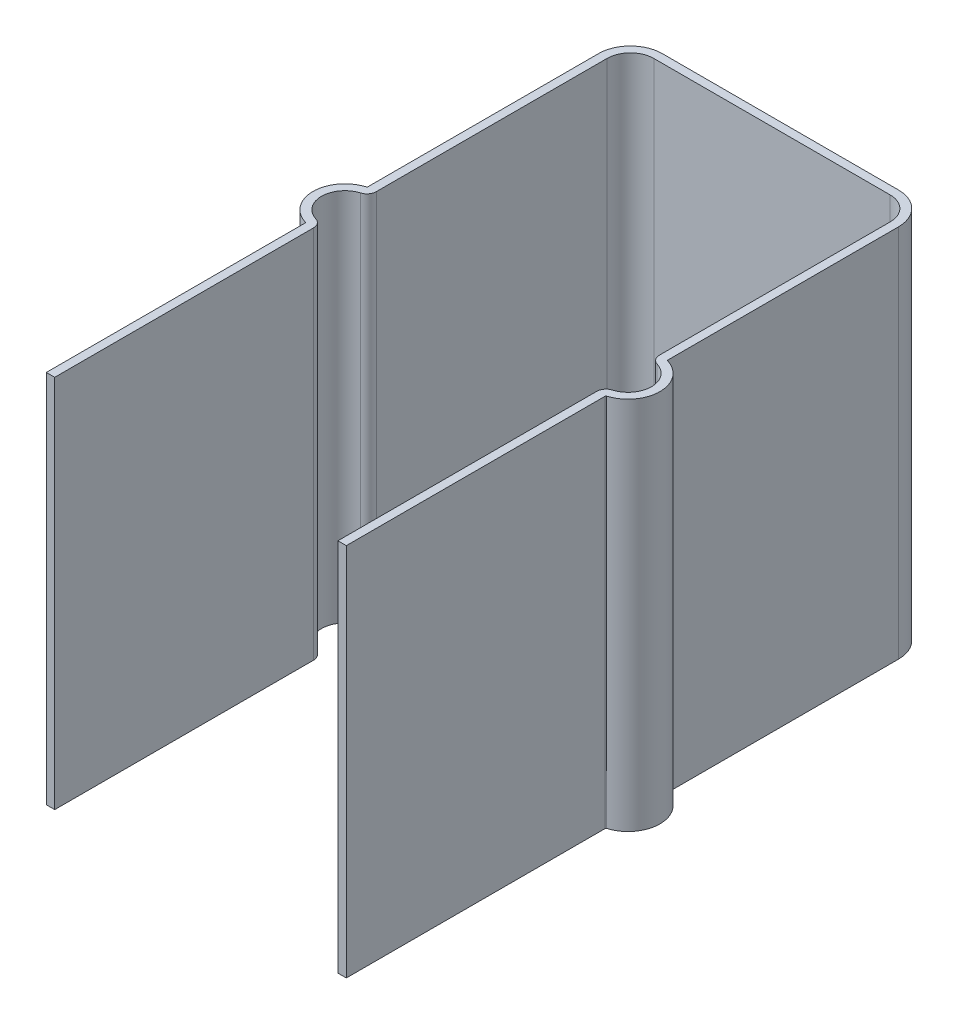
ISO-10303-21;
HEADER;
FILE_DESCRIPTION(('STEP AP214'),'2;1');
FILE_NAME('part.step','',(''),(''),'','','');
FILE_SCHEMA(('AUTOMOTIVE_DESIGN { 1 0 10303 214 1 1 1 1 }'));
ENDSEC;
DATA;
#1=APPLICATION_CONTEXT('core data for automotive mechanical design processes');
#2=APPLICATION_PROTOCOL_DEFINITION('international standard','automotive_design',2000,#1);
#3=PRODUCT_CONTEXT('',#1,'mechanical');
#4=PRODUCT('Part','Part','',(#3));
#5=PRODUCT_RELATED_PRODUCT_CATEGORY('part','',(#4));
#6=PRODUCT_DEFINITION_FORMATION('','',#4);
#7=PRODUCT_DEFINITION_CONTEXT('part definition',#1,'design');
#8=PRODUCT_DEFINITION('design','',#6,#7);
#9=PRODUCT_DEFINITION_SHAPE('','',#8);
#10=(LENGTH_UNIT() NAMED_UNIT(*) SI_UNIT(.MILLI.,.METRE.));
#11=(NAMED_UNIT(*) PLANE_ANGLE_UNIT() SI_UNIT($,.RADIAN.));
#12=(NAMED_UNIT(*) SI_UNIT($,.STERADIAN.) SOLID_ANGLE_UNIT());
#13=UNCERTAINTY_MEASURE_WITH_UNIT(LENGTH_MEASURE(1.E-05),#10,'distance_accuracy_value','');
#14=(GEOMETRIC_REPRESENTATION_CONTEXT(3) GLOBAL_UNCERTAINTY_ASSIGNED_CONTEXT((#13)) GLOBAL_UNIT_ASSIGNED_CONTEXT((#10,
#11,#12)) REPRESENTATION_CONTEXT('',''));
#15=CARTESIAN_POINT('',(0.,0.,0.));
#16=DIRECTION('',(0.,0.,1.));
#17=DIRECTION('',(1.,0.,0.));
#18=AXIS2_PLACEMENT_3D('',#15,#16,#17);
#19=CARTESIAN_POINT('',(3.025,8.,0.670820393249937));
#20=DIRECTION('',(1.,0.,0.));
#21=DIRECTION('',(0.,0.,-1.));
#22=AXIS2_PLACEMENT_3D('',#19,#20,#21);
#23=PLANE('',#22);
#24=DIRECTION('',(0.,0.,1.));
#25=VECTOR('',#24,1.);
#26=CARTESIAN_POINT('',(3.025,0.,0.670820393249937));
#27=LINE('',#26,#25);
#28=CARTESIAN_POINT('',(3.025,0.,0.670820393249937));
#29=VERTEX_POINT('',#28);
#30=CARTESIAN_POINT('',(3.025,0.,6.2));
#31=VERTEX_POINT('',#30);
#32=EDGE_CURVE('E247',#29,#31,#27,.T.);
#33=ORIENTED_EDGE('',*,*,#32,.T.);
#34=DIRECTION('',(0.,-1.,0.));
#35=VECTOR('',#34,1.);
#36=CARTESIAN_POINT('',(3.025,8.,6.2));
#37=LINE('',#36,#35);
#38=CARTESIAN_POINT('',(3.025,8.,6.2));
#39=VERTEX_POINT('',#38);
#40=EDGE_CURVE('E11',#39,#31,#37,.T.);
#41=ORIENTED_EDGE('',*,*,#40,.F.);
#42=DIRECTION('',(0.,0.,1.));
#43=VECTOR('',#42,1.);
#44=CARTESIAN_POINT('',(3.025,8.,0.670820393249937));
#45=LINE('',#44,#43);
#46=CARTESIAN_POINT('',(3.025,8.,0.670820393249937));
#47=VERTEX_POINT('',#46);
#48=EDGE_CURVE('E148',#47,#39,#45,.T.);
#49=ORIENTED_EDGE('',*,*,#48,.F.);
#50=DIRECTION('',(0.,-1.,0.));
#51=VECTOR('',#50,1.);
#52=CARTESIAN_POINT('',(3.025,8.,0.670820393249937));
#53=LINE('',#52,#51);
#54=EDGE_CURVE('E243',#47,#29,#53,.T.);
#55=ORIENTED_EDGE('',*,*,#54,.T.);
#56=EDGE_LOOP('',(#33,#41,#49,#55));
#57=FACE_BOUND('',#56,.T.);
#58=ADVANCED_FACE('F32',(#57),#23,.F.);
#59=CARTESIAN_POINT('',(3.205,8.,6.2));
#60=DIRECTION('',(0.,0.,1.));
#61=DIRECTION('',(1.,0.,0.));
#62=AXIS2_PLACEMENT_3D('',#59,#60,#61);
#63=PLANE('',#62);
#64=DIRECTION('',(-1.,0.,0.));
#65=VECTOR('',#64,1.);
#66=CARTESIAN_POINT('',(3.205,0.,6.2));
#67=LINE('',#66,#65);
#68=CARTESIAN_POINT('',(3.205,0.,6.2));
#69=VERTEX_POINT('',#68);
#70=EDGE_CURVE('E250',#69,#31,#67,.T.);
#71=ORIENTED_EDGE('',*,*,#70,.F.);
#72=DIRECTION('',(0.,-1.,0.));
#73=VECTOR('',#72,1.);
#74=CARTESIAN_POINT('',(3.205,8.,6.2));
#75=LINE('',#74,#73);
#76=CARTESIAN_POINT('',(3.205,8.,6.2));
#77=VERTEX_POINT('',#76);
#78=EDGE_CURVE('E40',#77,#69,#75,.T.);
#79=ORIENTED_EDGE('',*,*,#78,.F.);
#80=DIRECTION('',(-1.,0.,0.));
#81=VECTOR('',#80,1.);
#82=CARTESIAN_POINT('',(3.205,8.,6.2));
#83=LINE('',#82,#81);
#84=EDGE_CURVE('E392',#77,#39,#83,.T.);
#85=ORIENTED_EDGE('',*,*,#84,.T.);
#86=ORIENTED_EDGE('',*,*,#40,.T.);
#87=EDGE_LOOP('',(#71,#79,#85,#86));
#88=FACE_BOUND('',#87,.T.);
#89=ADVANCED_FACE('F379',(#88),#63,.T.);
#90=CARTESIAN_POINT('',(3.205,8.,0.670820393249937));
#91=DIRECTION('',(1.,0.,0.));
#92=DIRECTION('',(0.,0.,-1.));
#93=AXIS2_PLACEMENT_3D('',#90,#91,#92);
#94=PLANE('',#93);
#95=DIRECTION('',(0.,0.,1.));
#96=VECTOR('',#95,1.);
#97=CARTESIAN_POINT('',(3.205,0.,0.670820393249937));
#98=LINE('',#97,#96);
#99=CARTESIAN_POINT('',(3.205,0.,0.670820393249937));
#100=VERTEX_POINT('',#99);
#101=EDGE_CURVE('E253',#100,#69,#98,.T.);
#102=ORIENTED_EDGE('',*,*,#101,.F.);
#103=DIRECTION('',(0.,-1.,0.));
#104=VECTOR('',#103,1.);
#105=CARTESIAN_POINT('',(3.205,8.,0.670820393249937));
#106=LINE('',#105,#104);
#107=CARTESIAN_POINT('',(3.205,8.,0.670820393249937));
#108=VERTEX_POINT('',#107);
#109=EDGE_CURVE('E369',#108,#100,#106,.T.);
#110=ORIENTED_EDGE('',*,*,#109,.F.);
#111=DIRECTION('',(0.,0.,1.));
#112=VECTOR('',#111,1.);
#113=CARTESIAN_POINT('',(3.205,8.,0.670820393249937));
#114=LINE('',#113,#112);
#115=EDGE_CURVE('E376',#108,#77,#114,.T.);
#116=ORIENTED_EDGE('',*,*,#115,.T.);
#117=ORIENTED_EDGE('',*,*,#78,.T.);
#118=EDGE_LOOP('',(#102,#110,#116,#117));
#119=FACE_BOUND('',#118,.T.);
#120=ADVANCED_FACE('F374',(#119),#94,.T.);
#121=CARTESIAN_POINT('',(3.225,8.,0.670820393249937));
#122=DIRECTION('',(0.,-1.,0.));
#123=DIRECTION('',(0.,0.,-1.));
#124=AXIS2_PLACEMENT_3D('',#121,#122,#123);
#125=CYLINDRICAL_SURFACE('',#124,0.0199999999999998);
#126=CARTESIAN_POINT('',(3.225,0.,0.670820393249937));
#127=DIRECTION('',(0.,1.,0.));
#128=DIRECTION('',(1.,0.,0.));
#129=AXIS2_PLACEMENT_3D('',#126,#127,#128);
#130=CIRCLE('',#129,0.0199999999999998);
#131=CARTESIAN_POINT('',(3.21928571428571,0.,0.651654096299939));
#132=VERTEX_POINT('',#131);
#133=EDGE_CURVE('E256',#132,#100,#130,.T.);
#134=ORIENTED_EDGE('',*,*,#133,.F.);
#135=DIRECTION('',(0.,-1.,0.));
#136=VECTOR('',#135,1.);
#137=CARTESIAN_POINT('',(3.21928571428571,8.,0.651654096299939));
#138=LINE('',#137,#136);
#139=CARTESIAN_POINT('',(3.21928571428571,8.,0.651654096299939));
#140=VERTEX_POINT('',#139);
#141=EDGE_CURVE('E367',#140,#132,#138,.T.);
#142=ORIENTED_EDGE('',*,*,#141,.F.);
#143=CARTESIAN_POINT('',(3.225,8.,0.670820393249937));
#144=DIRECTION('',(0.,1.,0.));
#145=DIRECTION('',(1.,0.,0.));
#146=AXIS2_PLACEMENT_3D('',#143,#144,#145);
#147=CIRCLE('',#146,0.0199999999999998);
#148=EDGE_CURVE('E389',#140,#108,#147,.T.);
#149=ORIENTED_EDGE('',*,*,#148,.T.);
#150=ORIENTED_EDGE('',*,*,#109,.T.);
#151=EDGE_LOOP('',(#134,#142,#149,#150));
#152=FACE_BOUND('',#151,.T.);
#153=ADVANCED_FACE('F386',(#152),#125,.F.);
#154=CARTESIAN_POINT('',(3.025,8.,0.));
#155=DIRECTION('',(0.,-1.,0.));
#156=DIRECTION('',(0.,0.,-1.));
#157=AXIS2_PLACEMENT_3D('',#154,#155,#156);
#158=CYLINDRICAL_SURFACE('',#157,0.68);
#159=CARTESIAN_POINT('',(3.025,0.,0.));
#160=DIRECTION('',(0.,1.,0.));
#161=DIRECTION('',(1.,0.,0.));
#162=AXIS2_PLACEMENT_3D('',#159,#160,#161);
#163=CIRCLE('',#162,0.68);
#164=CARTESIAN_POINT('',(3.21928571428571,0.,-0.651654096299938));
#165=VERTEX_POINT('',#164);
#166=EDGE_CURVE('E259',#165,#132,#163,.F.);
#167=ORIENTED_EDGE('',*,*,#166,.F.);
#168=DIRECTION('',(0.,-1.,0.));
#169=VECTOR('',#168,1.);
#170=CARTESIAN_POINT('',(3.21928571428571,8.,-0.651654096299938));
#171=LINE('',#170,#169);
#172=CARTESIAN_POINT('',(3.21928571428571,8.,-0.651654096299938));
#173=VERTEX_POINT('',#172);
#174=EDGE_CURVE('E365',#173,#165,#171,.T.);
#175=ORIENTED_EDGE('',*,*,#174,.F.);
#176=CARTESIAN_POINT('',(3.025,8.,0.));
#177=DIRECTION('',(0.,1.,0.));
#178=DIRECTION('',(1.,0.,0.));
#179=AXIS2_PLACEMENT_3D('',#176,#177,#178);
#180=CIRCLE('',#179,0.68);
#181=EDGE_CURVE('E394',#173,#140,#180,.F.);
#182=ORIENTED_EDGE('',*,*,#181,.T.);
#183=ORIENTED_EDGE('',*,*,#141,.T.);
#184=EDGE_LOOP('',(#167,#175,#182,#183));
#185=FACE_BOUND('',#184,.T.);
#186=ADVANCED_FACE('F480',(#185),#158,.T.);
#187=CARTESIAN_POINT('',(3.225,8.,-0.670820393249937));
#188=DIRECTION('',(0.,-1.,0.));
#189=DIRECTION('',(0.,0.,-1.));
#190=AXIS2_PLACEMENT_3D('',#187,#188,#189);
#191=CYLINDRICAL_SURFACE('',#190,0.0200000000000002);
#192=CARTESIAN_POINT('',(3.225,0.,-0.670820393249937));
#193=DIRECTION('',(0.,1.,0.));
#194=DIRECTION('',(1.,0.,0.));
#195=AXIS2_PLACEMENT_3D('',#192,#193,#194);
#196=CIRCLE('',#195,0.0200000000000002);
#197=CARTESIAN_POINT('',(3.205,0.,-0.670820393249937));
#198=VERTEX_POINT('',#197);
#199=EDGE_CURVE('E262',#198,#165,#196,.T.);
#200=ORIENTED_EDGE('',*,*,#199,.F.);
#201=DIRECTION('',(0.,-1.,0.));
#202=VECTOR('',#201,1.);
#203=CARTESIAN_POINT('',(3.205,8.,-0.670820393249937));
#204=LINE('',#203,#202);
#205=CARTESIAN_POINT('',(3.205,8.,-0.670820393249937));
#206=VERTEX_POINT('',#205);
#207=EDGE_CURVE('E363',#206,#198,#204,.T.);
#208=ORIENTED_EDGE('',*,*,#207,.F.);
#209=CARTESIAN_POINT('',(3.225,8.,-0.670820393249937));
#210=DIRECTION('',(0.,1.,0.));
#211=DIRECTION('',(1.,0.,0.));
#212=AXIS2_PLACEMENT_3D('',#209,#210,#211);
#213=CIRCLE('',#212,0.0200000000000002);
#214=EDGE_CURVE('E400',#206,#173,#213,.T.);
#215=ORIENTED_EDGE('',*,*,#214,.T.);
#216=ORIENTED_EDGE('',*,*,#174,.T.);
#217=EDGE_LOOP('',(#200,#208,#215,#216));
#218=FACE_BOUND('',#217,.T.);
#219=ADVANCED_FACE('F483',(#218),#191,.F.);
#220=CARTESIAN_POINT('',(3.205,8.,-5.6));
#221=DIRECTION('',(1.,0.,0.));
#222=DIRECTION('',(0.,0.,-1.));
#223=AXIS2_PLACEMENT_3D('',#220,#221,#222);
#224=PLANE('',#223);
#225=DIRECTION('',(0.,0.,-1.));
#226=VECTOR('',#225,1.);
#227=CARTESIAN_POINT('',(3.205,0.,-5.6));
#228=LINE('',#227,#226);
#229=CARTESIAN_POINT('',(3.205,0.,-5.6));
#230=VERTEX_POINT('',#229);
#231=EDGE_CURVE('E265',#230,#198,#228,.F.);
#232=ORIENTED_EDGE('',*,*,#231,.F.);
#233=DIRECTION('',(0.,-1.,0.));
#234=VECTOR('',#233,1.);
#235=CARTESIAN_POINT('',(3.205,8.,-5.6));
#236=LINE('',#235,#234);
#237=CARTESIAN_POINT('',(3.205,8.,-5.6));
#238=VERTEX_POINT('',#237);
#239=EDGE_CURVE('E361',#238,#230,#236,.T.);
#240=ORIENTED_EDGE('',*,*,#239,.F.);
#241=DIRECTION('',(0.,0.,-1.));
#242=VECTOR('',#241,1.);
#243=CARTESIAN_POINT('',(3.205,8.,-5.6));
#244=LINE('',#243,#242);
#245=EDGE_CURVE('E403',#238,#206,#244,.F.);
#246=ORIENTED_EDGE('',*,*,#245,.T.);
#247=ORIENTED_EDGE('',*,*,#207,.T.);
#248=EDGE_LOOP('',(#232,#240,#246,#247));
#249=FACE_BOUND('',#248,.T.);
#250=ADVANCED_FACE('F487',(#249),#224,.T.);
#251=CARTESIAN_POINT('',(2.525,8.,-5.6));
#252=DIRECTION('',(0.,-1.,0.));
#253=DIRECTION('',(0.,0.,-1.));
#254=AXIS2_PLACEMENT_3D('',#251,#252,#253);
#255=CYLINDRICAL_SURFACE('',#254,0.68);
#256=CARTESIAN_POINT('',(2.525,0.,-5.6));
#257=DIRECTION('',(0.,1.,0.));
#258=DIRECTION('',(1.,0.,0.));
#259=AXIS2_PLACEMENT_3D('',#256,#257,#258);
#260=CIRCLE('',#259,0.68);
#261=CARTESIAN_POINT('',(2.525,0.,-6.28));
#262=VERTEX_POINT('',#261);
#263=EDGE_CURVE('E268',#262,#230,#260,.F.);
#264=ORIENTED_EDGE('',*,*,#263,.F.);
#265=DIRECTION('',(0.,-1.,0.));
#266=VECTOR('',#265,1.);
#267=CARTESIAN_POINT('',(2.525,8.,-6.28));
#268=LINE('',#267,#266);
#269=CARTESIAN_POINT('',(2.525,8.,-6.28));
#270=VERTEX_POINT('',#269);
#271=EDGE_CURVE('E359',#270,#262,#268,.T.);
#272=ORIENTED_EDGE('',*,*,#271,.F.);
#273=CARTESIAN_POINT('',(2.525,8.,-5.6));
#274=DIRECTION('',(0.,1.,0.));
#275=DIRECTION('',(1.,0.,0.));
#276=AXIS2_PLACEMENT_3D('',#273,#274,#275);
#277=CIRCLE('',#276,0.68);
#278=EDGE_CURVE('E406',#270,#238,#277,.F.);
#279=ORIENTED_EDGE('',*,*,#278,.T.);
#280=ORIENTED_EDGE('',*,*,#239,.T.);
#281=EDGE_LOOP('',(#264,#272,#279,#280));
#282=FACE_BOUND('',#281,.T.);
#283=ADVANCED_FACE('F491',(#282),#255,.T.);
#284=CARTESIAN_POINT('',(-2.525,8.,-6.28));
#285=DIRECTION('',(0.,0.,-1.));
#286=DIRECTION('',(-1.,0.,0.));
#287=AXIS2_PLACEMENT_3D('',#284,#285,#286);
#288=PLANE('',#287);
#289=DIRECTION('',(1.,0.,0.));
#290=VECTOR('',#289,1.);
#291=CARTESIAN_POINT('',(-2.525,0.,-6.28));
#292=LINE('',#291,#290);
#293=CARTESIAN_POINT('',(-2.525,0.,-6.28));
#294=VERTEX_POINT('',#293);
#295=EDGE_CURVE('E271',#294,#262,#292,.T.);
#296=ORIENTED_EDGE('',*,*,#295,.F.);
#297=DIRECTION('',(0.,-1.,0.));
#298=VECTOR('',#297,1.);
#299=CARTESIAN_POINT('',(-2.525,8.,-6.28));
#300=LINE('',#299,#298);
#301=CARTESIAN_POINT('',(-2.525,8.,-6.28));
#302=VERTEX_POINT('',#301);
#303=EDGE_CURVE('E357',#302,#294,#300,.T.);
#304=ORIENTED_EDGE('',*,*,#303,.F.);
#305=DIRECTION('',(1.,0.,0.));
#306=VECTOR('',#305,1.);
#307=CARTESIAN_POINT('',(-2.525,8.,-6.28));
#308=LINE('',#307,#306);
#309=EDGE_CURVE('E409',#302,#270,#308,.T.);
#310=ORIENTED_EDGE('',*,*,#309,.T.);
#311=ORIENTED_EDGE('',*,*,#271,.T.);
#312=EDGE_LOOP('',(#296,#304,#310,#311));
#313=FACE_BOUND('',#312,.T.);
#314=ADVANCED_FACE('F495',(#313),#288,.T.);
#315=CARTESIAN_POINT('',(-2.525,8.,-5.6));
#316=DIRECTION('',(0.,-1.,0.));
#317=DIRECTION('',(0.,0.,-1.));
#318=AXIS2_PLACEMENT_3D('',#315,#316,#317);
#319=CYLINDRICAL_SURFACE('',#318,0.68);
#320=CARTESIAN_POINT('',(-2.525,0.,-5.6));
#321=DIRECTION('',(0.,1.,0.));
#322=DIRECTION('',(1.,0.,0.));
#323=AXIS2_PLACEMENT_3D('',#320,#321,#322);
#324=CIRCLE('',#323,0.68);
#325=CARTESIAN_POINT('',(-3.205,0.,-5.6));
#326=VERTEX_POINT('',#325);
#327=EDGE_CURVE('E274',#326,#294,#324,.F.);
#328=ORIENTED_EDGE('',*,*,#327,.F.);
#329=DIRECTION('',(0.,-1.,0.));
#330=VECTOR('',#329,1.);
#331=CARTESIAN_POINT('',(-3.205,8.,-5.6));
#332=LINE('',#331,#330);
#333=CARTESIAN_POINT('',(-3.205,8.,-5.6));
#334=VERTEX_POINT('',#333);
#335=EDGE_CURVE('E355',#334,#326,#332,.T.);
#336=ORIENTED_EDGE('',*,*,#335,.F.);
#337=CARTESIAN_POINT('',(-2.525,8.,-5.6));
#338=DIRECTION('',(0.,1.,0.));
#339=DIRECTION('',(1.,0.,0.));
#340=AXIS2_PLACEMENT_3D('',#337,#338,#339);
#341=CIRCLE('',#340,0.68);
#342=EDGE_CURVE('E412',#334,#302,#341,.F.);
#343=ORIENTED_EDGE('',*,*,#342,.T.);
#344=ORIENTED_EDGE('',*,*,#303,.T.);
#345=EDGE_LOOP('',(#328,#336,#343,#344));
#346=FACE_BOUND('',#345,.T.);
#347=ADVANCED_FACE('F499',(#346),#319,.T.);
#348=CARTESIAN_POINT('',(-3.205,8.,-0.670820393249937));
#349=DIRECTION('',(-1.,0.,0.));
#350=DIRECTION('',(0.,0.,1.));
#351=AXIS2_PLACEMENT_3D('',#348,#349,#350);
#352=PLANE('',#351);
#353=DIRECTION('',(0.,0.,-1.));
#354=VECTOR('',#353,1.);
#355=CARTESIAN_POINT('',(-3.205,0.,-0.670820393249937));
#356=LINE('',#355,#354);
#357=CARTESIAN_POINT('',(-3.205,0.,-0.670820393249937));
#358=VERTEX_POINT('',#357);
#359=EDGE_CURVE('E277',#358,#326,#356,.T.);
#360=ORIENTED_EDGE('',*,*,#359,.F.);
#361=DIRECTION('',(0.,-1.,0.));
#362=VECTOR('',#361,1.);
#363=CARTESIAN_POINT('',(-3.205,8.,-0.670820393249937));
#364=LINE('',#363,#362);
#365=CARTESIAN_POINT('',(-3.205,8.,-0.670820393249937));
#366=VERTEX_POINT('',#365);
#367=EDGE_CURVE('E353',#366,#358,#364,.T.);
#368=ORIENTED_EDGE('',*,*,#367,.F.);
#369=DIRECTION('',(0.,0.,-1.));
#370=VECTOR('',#369,1.);
#371=CARTESIAN_POINT('',(-3.205,8.,-0.670820393249937));
#372=LINE('',#371,#370);
#373=EDGE_CURVE('E415',#366,#334,#372,.T.);
#374=ORIENTED_EDGE('',*,*,#373,.T.);
#375=ORIENTED_EDGE('',*,*,#335,.T.);
#376=EDGE_LOOP('',(#360,#368,#374,#375));
#377=FACE_BOUND('',#376,.T.);
#378=ADVANCED_FACE('F503',(#377),#352,.T.);
#379=CARTESIAN_POINT('',(-3.225,8.,-0.670820393249937));
#380=DIRECTION('',(0.,-1.,0.));
#381=DIRECTION('',(0.,0.,-1.));
#382=AXIS2_PLACEMENT_3D('',#379,#380,#381);
#383=CYLINDRICAL_SURFACE('',#382,0.0199999999999998);
#384=CARTESIAN_POINT('',(-3.225,0.,-0.670820393249937));
#385=DIRECTION('',(0.,1.,0.));
#386=DIRECTION('',(1.,0.,0.));
#387=AXIS2_PLACEMENT_3D('',#384,#385,#386);
#388=CIRCLE('',#387,0.0199999999999998);
#389=CARTESIAN_POINT('',(-3.21928571428571,0.,-0.651654096299939));
#390=VERTEX_POINT('',#389);
#391=EDGE_CURVE('E280',#390,#358,#388,.T.);
#392=ORIENTED_EDGE('',*,*,#391,.F.);
#393=DIRECTION('',(0.,-1.,0.));
#394=VECTOR('',#393,1.);
#395=CARTESIAN_POINT('',(-3.21928571428571,8.,-0.651654096299939));
#396=LINE('',#395,#394);
#397=CARTESIAN_POINT('',(-3.21928571428571,8.,-0.651654096299939));
#398=VERTEX_POINT('',#397);
#399=EDGE_CURVE('E351',#398,#390,#396,.T.);
#400=ORIENTED_EDGE('',*,*,#399,.F.);
#401=CARTESIAN_POINT('',(-3.225,8.,-0.670820393249937));
#402=DIRECTION('',(0.,1.,0.));
#403=DIRECTION('',(1.,0.,0.));
#404=AXIS2_PLACEMENT_3D('',#401,#402,#403);
#405=CIRCLE('',#404,0.0199999999999998);
#406=EDGE_CURVE('E418',#398,#366,#405,.T.);
#407=ORIENTED_EDGE('',*,*,#406,.T.);
#408=ORIENTED_EDGE('',*,*,#367,.T.);
#409=EDGE_LOOP('',(#392,#400,#407,#408));
#410=FACE_BOUND('',#409,.T.);
#411=ADVANCED_FACE('F507',(#410),#383,.F.);
#412=CARTESIAN_POINT('',(-3.025,8.,0.));
#413=DIRECTION('',(0.,-1.,0.));
#414=DIRECTION('',(0.,0.,-1.));
#415=AXIS2_PLACEMENT_3D('',#412,#413,#414);
#416=CYLINDRICAL_SURFACE('',#415,0.68);
#417=CARTESIAN_POINT('',(-3.025,0.,0.));
#418=DIRECTION('',(0.,1.,0.));
#419=DIRECTION('',(1.,0.,0.));
#420=AXIS2_PLACEMENT_3D('',#417,#418,#419);
#421=CIRCLE('',#420,0.68);
#422=CARTESIAN_POINT('',(-3.21928571428571,0.,0.651654096299939));
#423=VERTEX_POINT('',#422);
#424=EDGE_CURVE('E283',#423,#390,#421,.F.);
#425=ORIENTED_EDGE('',*,*,#424,.F.);
#426=DIRECTION('',(0.,-1.,0.));
#427=VECTOR('',#426,1.);
#428=CARTESIAN_POINT('',(-3.21928571428571,8.,0.651654096299939));
#429=LINE('',#428,#427);
#430=CARTESIAN_POINT('',(-3.21928571428571,8.,0.651654096299939));
#431=VERTEX_POINT('',#430);
#432=EDGE_CURVE('E349',#431,#423,#429,.T.);
#433=ORIENTED_EDGE('',*,*,#432,.F.);
#434=CARTESIAN_POINT('',(-3.025,8.,0.));
#435=DIRECTION('',(0.,1.,0.));
#436=DIRECTION('',(1.,0.,0.));
#437=AXIS2_PLACEMENT_3D('',#434,#435,#436);
#438=CIRCLE('',#437,0.68);
#439=EDGE_CURVE('E421',#431,#398,#438,.F.);
#440=ORIENTED_EDGE('',*,*,#439,.T.);
#441=ORIENTED_EDGE('',*,*,#399,.T.);
#442=EDGE_LOOP('',(#425,#433,#440,#441));
#443=FACE_BOUND('',#442,.T.);
#444=ADVANCED_FACE('F511',(#443),#416,.T.);
#445=CARTESIAN_POINT('',(-3.225,8.,0.670820393249937));
#446=DIRECTION('',(0.,-1.,0.));
#447=DIRECTION('',(0.,0.,-1.));
#448=AXIS2_PLACEMENT_3D('',#445,#446,#447);
#449=CYLINDRICAL_SURFACE('',#448,0.0199999999999998);
#450=CARTESIAN_POINT('',(-3.225,0.,0.670820393249937));
#451=DIRECTION('',(0.,1.,0.));
#452=DIRECTION('',(1.,0.,0.));
#453=AXIS2_PLACEMENT_3D('',#450,#451,#452);
#454=CIRCLE('',#453,0.0199999999999998);
#455=CARTESIAN_POINT('',(-3.205,0.,0.670820393249937));
#456=VERTEX_POINT('',#455);
#457=EDGE_CURVE('E286',#456,#423,#454,.T.);
#458=ORIENTED_EDGE('',*,*,#457,.F.);
#459=DIRECTION('',(0.,-1.,0.));
#460=VECTOR('',#459,1.);
#461=CARTESIAN_POINT('',(-3.205,8.,0.670820393249937));
#462=LINE('',#461,#460);
#463=CARTESIAN_POINT('',(-3.205,8.,0.670820393249937));
#464=VERTEX_POINT('',#463);
#465=EDGE_CURVE('E347',#464,#456,#462,.T.);
#466=ORIENTED_EDGE('',*,*,#465,.F.);
#467=CARTESIAN_POINT('',(-3.225,8.,0.670820393249937));
#468=DIRECTION('',(0.,1.,0.));
#469=DIRECTION('',(1.,0.,0.));
#470=AXIS2_PLACEMENT_3D('',#467,#468,#469);
#471=CIRCLE('',#470,0.0199999999999998);
#472=EDGE_CURVE('E424',#464,#431,#471,.T.);
#473=ORIENTED_EDGE('',*,*,#472,.T.);
#474=ORIENTED_EDGE('',*,*,#432,.T.);
#475=EDGE_LOOP('',(#458,#466,#473,#474));
#476=FACE_BOUND('',#475,.T.);
#477=ADVANCED_FACE('F515',(#476),#449,.F.);
#478=CARTESIAN_POINT('',(-3.205,8.,0.670820393249937));
#479=DIRECTION('',(-1.,0.,0.));
#480=DIRECTION('',(0.,0.,1.));
#481=AXIS2_PLACEMENT_3D('',#478,#479,#480);
#482=PLANE('',#481);
#483=DIRECTION('',(0.,0.,-1.));
#484=VECTOR('',#483,1.);
#485=CARTESIAN_POINT('',(-3.205,0.,0.670820393249937));
#486=LINE('',#485,#484);
#487=CARTESIAN_POINT('',(-3.205,0.,6.2));
#488=VERTEX_POINT('',#487);
#489=EDGE_CURVE('E289',#488,#456,#486,.T.);
#490=ORIENTED_EDGE('',*,*,#489,.F.);
#491=DIRECTION('',(0.,-1.,0.));
#492=VECTOR('',#491,1.);
#493=CARTESIAN_POINT('',(-3.205,8.,6.2));
#494=LINE('',#493,#492);
#495=CARTESIAN_POINT('',(-3.205,8.,6.2));
#496=VERTEX_POINT('',#495);
#497=EDGE_CURVE('E345',#496,#488,#494,.T.);
#498=ORIENTED_EDGE('',*,*,#497,.F.);
#499=DIRECTION('',(0.,0.,-1.));
#500=VECTOR('',#499,1.);
#501=CARTESIAN_POINT('',(-3.205,8.,0.670820393249937));
#502=LINE('',#501,#500);
#503=EDGE_CURVE('E427',#496,#464,#502,.T.);
#504=ORIENTED_EDGE('',*,*,#503,.T.);
#505=ORIENTED_EDGE('',*,*,#465,.T.);
#506=EDGE_LOOP('',(#490,#498,#504,#505));
#507=FACE_BOUND('',#506,.T.);
#508=ADVANCED_FACE('F519',(#507),#482,.T.);
#509=CARTESIAN_POINT('',(-3.025,8.,6.2));
#510=DIRECTION('',(0.,0.,1.));
#511=DIRECTION('',(1.,0.,0.));
#512=AXIS2_PLACEMENT_3D('',#509,#510,#511);
#513=PLANE('',#512);
#514=DIRECTION('',(-1.,0.,0.));
#515=VECTOR('',#514,1.);
#516=CARTESIAN_POINT('',(-3.025,0.,6.2));
#517=LINE('',#516,#515);
#518=CARTESIAN_POINT('',(-3.025,0.,6.2));
#519=VERTEX_POINT('',#518);
#520=EDGE_CURVE('E292',#519,#488,#517,.T.);
#521=ORIENTED_EDGE('',*,*,#520,.F.);
#522=DIRECTION('',(0.,-1.,0.));
#523=VECTOR('',#522,1.);
#524=CARTESIAN_POINT('',(-3.025,8.,6.2));
#525=LINE('',#524,#523);
#526=CARTESIAN_POINT('',(-3.025,8.,6.2));
#527=VERTEX_POINT('',#526);
#528=EDGE_CURVE('E343',#527,#519,#525,.T.);
#529=ORIENTED_EDGE('',*,*,#528,.F.);
#530=DIRECTION('',(-1.,0.,0.));
#531=VECTOR('',#530,1.);
#532=CARTESIAN_POINT('',(-3.025,8.,6.2));
#533=LINE('',#532,#531);
#534=EDGE_CURVE('E430',#527,#496,#533,.T.);
#535=ORIENTED_EDGE('',*,*,#534,.T.);
#536=ORIENTED_EDGE('',*,*,#497,.T.);
#537=EDGE_LOOP('',(#521,#529,#535,#536));
#538=FACE_BOUND('',#537,.T.);
#539=ADVANCED_FACE('F523',(#538),#513,.T.);
#540=CARTESIAN_POINT('',(-3.025,8.,0.670820393249937));
#541=DIRECTION('',(-1.,0.,0.));
#542=DIRECTION('',(0.,0.,1.));
#543=AXIS2_PLACEMENT_3D('',#540,#541,#542);
#544=PLANE('',#543);
#545=DIRECTION('',(0.,0.,-1.));
#546=VECTOR('',#545,1.);
#547=CARTESIAN_POINT('',(-3.025,0.,0.670820393249937));
#548=LINE('',#547,#546);
#549=CARTESIAN_POINT('',(-3.025,0.,0.670820393249937));
#550=VERTEX_POINT('',#549);
#551=EDGE_CURVE('E295',#519,#550,#548,.T.);
#552=ORIENTED_EDGE('',*,*,#551,.T.);
#553=DIRECTION('',(0.,-1.,0.));
#554=VECTOR('',#553,1.);
#555=CARTESIAN_POINT('',(-3.025,8.,0.670820393249937));
#556=LINE('',#555,#554);
#557=CARTESIAN_POINT('',(-3.025,8.,0.670820393249937));
#558=VERTEX_POINT('',#557);
#559=EDGE_CURVE('E340',#558,#550,#556,.T.);
#560=ORIENTED_EDGE('',*,*,#559,.F.);
#561=DIRECTION('',(0.,0.,-1.));
#562=VECTOR('',#561,1.);
#563=CARTESIAN_POINT('',(-3.025,8.,0.670820393249937));
#564=LINE('',#563,#562);
#565=EDGE_CURVE('E433',#527,#558,#564,.T.);
#566=ORIENTED_EDGE('',*,*,#565,.F.);
#567=ORIENTED_EDGE('',*,*,#528,.T.);
#568=EDGE_LOOP('',(#552,#560,#566,#567));
#569=FACE_BOUND('',#568,.T.);
#570=ADVANCED_FACE('F527',(#569),#544,.F.);
#571=CARTESIAN_POINT('',(-3.225,8.,0.670820393249937));
#572=DIRECTION('',(0.,-1.,0.));
#573=DIRECTION('',(0.,0.,-1.));
#574=AXIS2_PLACEMENT_3D('',#571,#572,#573);
#575=CYLINDRICAL_SURFACE('',#574,0.2);
#576=CARTESIAN_POINT('',(-3.225,0.,0.670820393249937));
#577=DIRECTION('',(0.,1.,0.));
#578=DIRECTION('',(0.,0.,1.));
#579=AXIS2_PLACEMENT_3D('',#576,#577,#578);
#580=CIRCLE('',#579,0.2);
#581=CARTESIAN_POINT('',(-3.16785714285714,0.,0.479157423749955));
#582=VERTEX_POINT('',#581);
#583=EDGE_CURVE('E297',#550,#582,#580,.T.);
#584=ORIENTED_EDGE('',*,*,#583,.T.);
#585=DIRECTION('',(0.,-1.,0.));
#586=VECTOR('',#585,1.);
#587=CARTESIAN_POINT('',(-3.16785714285714,8.,0.479157423749955));
#588=LINE('',#587,#586);
#589=CARTESIAN_POINT('',(-3.16785714285714,8.,0.479157423749955));
#590=VERTEX_POINT('',#589);
#591=EDGE_CURVE('E337',#590,#582,#588,.T.);
#592=ORIENTED_EDGE('',*,*,#591,.F.);
#593=CARTESIAN_POINT('',(-3.225,8.,0.670820393249937));
#594=DIRECTION('',(0.,1.,0.));
#595=DIRECTION('',(0.,0.,1.));
#596=AXIS2_PLACEMENT_3D('',#593,#594,#595);
#597=CIRCLE('',#596,0.2);
#598=EDGE_CURVE('E435',#558,#590,#597,.T.);
#599=ORIENTED_EDGE('',*,*,#598,.F.);
#600=ORIENTED_EDGE('',*,*,#559,.T.);
#601=EDGE_LOOP('',(#584,#592,#599,#600));
#602=FACE_BOUND('',#601,.T.);
#603=ADVANCED_FACE('F531',(#602),#575,.T.);
#604=CARTESIAN_POINT('',(-3.025,8.,0.));
#605=DIRECTION('',(0.,-1.,0.));
#606=DIRECTION('',(0.,0.,-1.));
#607=AXIS2_PLACEMENT_3D('',#604,#605,#606);
#608=CYLINDRICAL_SURFACE('',#607,0.5);
#609=CARTESIAN_POINT('',(-3.025,0.,0.));
#610=DIRECTION('',(0.,-1.,0.));
#611=DIRECTION('',(0.,0.,1.));
#612=AXIS2_PLACEMENT_3D('',#609,#610,#611);
#613=CIRCLE('',#612,0.5);
#614=CARTESIAN_POINT('',(-3.16785714285714,0.,-0.479157423749955));
#615=VERTEX_POINT('',#614);
#616=EDGE_CURVE('E299',#582,#615,#613,.T.);
#617=ORIENTED_EDGE('',*,*,#616,.T.);
#618=DIRECTION('',(0.,-1.,0.));
#619=VECTOR('',#618,1.);
#620=CARTESIAN_POINT('',(-3.16785714285714,8.,-0.479157423749955));
#621=LINE('',#620,#619);
#622=CARTESIAN_POINT('',(-3.16785714285714,8.,-0.479157423749955));
#623=VERTEX_POINT('',#622);
#624=EDGE_CURVE('E334',#623,#615,#621,.T.);
#625=ORIENTED_EDGE('',*,*,#624,.F.);
#626=CARTESIAN_POINT('',(-3.025,8.,0.));
#627=DIRECTION('',(0.,-1.,0.));
#628=DIRECTION('',(0.,0.,1.));
#629=AXIS2_PLACEMENT_3D('',#626,#627,#628);
#630=CIRCLE('',#629,0.5);
#631=EDGE_CURVE('E437',#590,#623,#630,.T.);
#632=ORIENTED_EDGE('',*,*,#631,.F.);
#633=ORIENTED_EDGE('',*,*,#591,.T.);
#634=EDGE_LOOP('',(#617,#625,#632,#633));
#635=FACE_BOUND('',#634,.T.);
#636=ADVANCED_FACE('F535',(#635),#608,.F.);
#637=CARTESIAN_POINT('',(-3.225,8.,-0.670820393249937));
#638=DIRECTION('',(0.,-1.,0.));
#639=DIRECTION('',(0.,0.,-1.));
#640=AXIS2_PLACEMENT_3D('',#637,#638,#639);
#641=CYLINDRICAL_SURFACE('',#640,0.2);
#642=CARTESIAN_POINT('',(-3.225,0.,-0.670820393249937));
#643=DIRECTION('',(0.,1.,0.));
#644=DIRECTION('',(0.,0.,-1.));
#645=AXIS2_PLACEMENT_3D('',#642,#643,#644);
#646=CIRCLE('',#645,0.2);
#647=CARTESIAN_POINT('',(-3.025,0.,-0.670820393249937));
#648=VERTEX_POINT('',#647);
#649=EDGE_CURVE('E301',#615,#648,#646,.T.);
#650=ORIENTED_EDGE('',*,*,#649,.T.);
#651=DIRECTION('',(0.,-1.,0.));
#652=VECTOR('',#651,1.);
#653=CARTESIAN_POINT('',(-3.025,8.,-0.670820393249937));
#654=LINE('',#653,#652);
#655=CARTESIAN_POINT('',(-3.025,8.,-0.670820393249937));
#656=VERTEX_POINT('',#655);
#657=EDGE_CURVE('E331',#656,#648,#654,.T.);
#658=ORIENTED_EDGE('',*,*,#657,.F.);
#659=CARTESIAN_POINT('',(-3.225,8.,-0.670820393249937));
#660=DIRECTION('',(0.,1.,0.));
#661=DIRECTION('',(0.,0.,-1.));
#662=AXIS2_PLACEMENT_3D('',#659,#660,#661);
#663=CIRCLE('',#662,0.2);
#664=EDGE_CURVE('E439',#623,#656,#663,.T.);
#665=ORIENTED_EDGE('',*,*,#664,.F.);
#666=ORIENTED_EDGE('',*,*,#624,.T.);
#667=EDGE_LOOP('',(#650,#658,#665,#666));
#668=FACE_BOUND('',#667,.T.);
#669=ADVANCED_FACE('F539',(#668),#641,.T.);
#670=CARTESIAN_POINT('',(-3.025,8.,-0.670820393249937));
#671=DIRECTION('',(-1.,0.,0.));
#672=DIRECTION('',(0.,0.,1.));
#673=AXIS2_PLACEMENT_3D('',#670,#671,#672);
#674=PLANE('',#673);
#675=DIRECTION('',(0.,0.,-1.));
#676=VECTOR('',#675,1.);
#677=CARTESIAN_POINT('',(-3.025,0.,-0.670820393249937));
#678=LINE('',#677,#676);
#679=CARTESIAN_POINT('',(-3.025,0.,-5.6));
#680=VERTEX_POINT('',#679);
#681=EDGE_CURVE('E303',#648,#680,#678,.T.);
#682=ORIENTED_EDGE('',*,*,#681,.T.);
#683=DIRECTION('',(0.,-1.,0.));
#684=VECTOR('',#683,1.);
#685=CARTESIAN_POINT('',(-3.025,8.,-5.6));
#686=LINE('',#685,#684);
#687=CARTESIAN_POINT('',(-3.025,8.,-5.6));
#688=VERTEX_POINT('',#687);
#689=EDGE_CURVE('E328',#688,#680,#686,.T.);
#690=ORIENTED_EDGE('',*,*,#689,.F.);
#691=DIRECTION('',(0.,0.,-1.));
#692=VECTOR('',#691,1.);
#693=CARTESIAN_POINT('',(-3.025,8.,-0.670820393249937));
#694=LINE('',#693,#692);
#695=EDGE_CURVE('E441',#656,#688,#694,.T.);
#696=ORIENTED_EDGE('',*,*,#695,.F.);
#697=ORIENTED_EDGE('',*,*,#657,.T.);
#698=EDGE_LOOP('',(#682,#690,#696,#697));
#699=FACE_BOUND('',#698,.T.);
#700=ADVANCED_FACE('F543',(#699),#674,.F.);
#701=CARTESIAN_POINT('',(-2.525,8.,-5.6));
#702=DIRECTION('',(0.,-1.,0.));
#703=DIRECTION('',(0.,0.,-1.));
#704=AXIS2_PLACEMENT_3D('',#701,#702,#703);
#705=CYLINDRICAL_SURFACE('',#704,0.5);
#706=CARTESIAN_POINT('',(-2.525,0.,-5.6));
#707=DIRECTION('',(0.,-1.,0.));
#708=DIRECTION('',(0.,0.,-1.));
#709=AXIS2_PLACEMENT_3D('',#706,#707,#708);
#710=CIRCLE('',#709,0.5);
#711=CARTESIAN_POINT('',(-2.525,0.,-6.1));
#712=VERTEX_POINT('',#711);
#713=EDGE_CURVE('E305',#680,#712,#710,.T.);
#714=ORIENTED_EDGE('',*,*,#713,.T.);
#715=DIRECTION('',(0.,-1.,0.));
#716=VECTOR('',#715,1.);
#717=CARTESIAN_POINT('',(-2.525,8.,-6.1));
#718=LINE('',#717,#716);
#719=CARTESIAN_POINT('',(-2.525,8.,-6.1));
#720=VERTEX_POINT('',#719);
#721=EDGE_CURVE('E325',#720,#712,#718,.T.);
#722=ORIENTED_EDGE('',*,*,#721,.F.);
#723=CARTESIAN_POINT('',(-2.525,8.,-5.6));
#724=DIRECTION('',(0.,-1.,0.));
#725=DIRECTION('',(0.,0.,-1.));
#726=AXIS2_PLACEMENT_3D('',#723,#724,#725);
#727=CIRCLE('',#726,0.5);
#728=EDGE_CURVE('E443',#688,#720,#727,.T.);
#729=ORIENTED_EDGE('',*,*,#728,.F.);
#730=ORIENTED_EDGE('',*,*,#689,.T.);
#731=EDGE_LOOP('',(#714,#722,#729,#730));
#732=FACE_BOUND('',#731,.T.);
#733=ADVANCED_FACE('F547',(#732),#705,.F.);
#734=CARTESIAN_POINT('',(-2.525,8.,-6.1));
#735=DIRECTION('',(0.,0.,-1.));
#736=DIRECTION('',(-1.,0.,0.));
#737=AXIS2_PLACEMENT_3D('',#734,#735,#736);
#738=PLANE('',#737);
#739=DIRECTION('',(1.,0.,0.));
#740=VECTOR('',#739,1.);
#741=CARTESIAN_POINT('',(-2.525,0.,-6.1));
#742=LINE('',#741,#740);
#743=CARTESIAN_POINT('',(2.525,0.,-6.1));
#744=VERTEX_POINT('',#743);
#745=EDGE_CURVE('E307',#712,#744,#742,.T.);
#746=ORIENTED_EDGE('',*,*,#745,.T.);
#747=DIRECTION('',(0.,-1.,0.));
#748=VECTOR('',#747,1.);
#749=CARTESIAN_POINT('',(2.525,8.,-6.1));
#750=LINE('',#749,#748);
#751=CARTESIAN_POINT('',(2.525,8.,-6.1));
#752=VERTEX_POINT('',#751);
#753=EDGE_CURVE('E322',#752,#744,#750,.T.);
#754=ORIENTED_EDGE('',*,*,#753,.F.);
#755=DIRECTION('',(1.,0.,0.));
#756=VECTOR('',#755,1.);
#757=CARTESIAN_POINT('',(-2.525,8.,-6.1));
#758=LINE('',#757,#756);
#759=EDGE_CURVE('E445',#720,#752,#758,.T.);
#760=ORIENTED_EDGE('',*,*,#759,.F.);
#761=ORIENTED_EDGE('',*,*,#721,.T.);
#762=EDGE_LOOP('',(#746,#754,#760,#761));
#763=FACE_BOUND('',#762,.T.);
#764=ADVANCED_FACE('F551',(#763),#738,.F.);
#765=CARTESIAN_POINT('',(2.525,8.,-5.6));
#766=DIRECTION('',(0.,-1.,0.));
#767=DIRECTION('',(0.,0.,-1.));
#768=AXIS2_PLACEMENT_3D('',#765,#766,#767);
#769=CYLINDRICAL_SURFACE('',#768,0.5);
#770=CARTESIAN_POINT('',(2.525,0.,-5.6));
#771=DIRECTION('',(0.,-1.,0.));
#772=DIRECTION('',(0.,0.,-1.));
#773=AXIS2_PLACEMENT_3D('',#770,#771,#772);
#774=CIRCLE('',#773,0.5);
#775=CARTESIAN_POINT('',(3.025,0.,-5.6));
#776=VERTEX_POINT('',#775);
#777=EDGE_CURVE('E309',#744,#776,#774,.T.);
#778=ORIENTED_EDGE('',*,*,#777,.T.);
#779=DIRECTION('',(0.,-1.,0.));
#780=VECTOR('',#779,1.);
#781=CARTESIAN_POINT('',(3.025,8.,-5.6));
#782=LINE('',#781,#780);
#783=CARTESIAN_POINT('',(3.025,8.,-5.6));
#784=VERTEX_POINT('',#783);
#785=EDGE_CURVE('E319',#784,#776,#782,.T.);
#786=ORIENTED_EDGE('',*,*,#785,.F.);
#787=CARTESIAN_POINT('',(2.525,8.,-5.6));
#788=DIRECTION('',(0.,-1.,0.));
#789=DIRECTION('',(0.,0.,-1.));
#790=AXIS2_PLACEMENT_3D('',#787,#788,#789);
#791=CIRCLE('',#790,0.5);
#792=EDGE_CURVE('E447',#752,#784,#791,.T.);
#793=ORIENTED_EDGE('',*,*,#792,.F.);
#794=ORIENTED_EDGE('',*,*,#753,.T.);
#795=EDGE_LOOP('',(#778,#786,#793,#794));
#796=FACE_BOUND('',#795,.T.);
#797=ADVANCED_FACE('F453',(#796),#769,.F.);
#798=CARTESIAN_POINT('',(3.025,8.,-5.6));
#799=DIRECTION('',(1.,0.,0.));
#800=DIRECTION('',(0.,0.,-1.));
#801=AXIS2_PLACEMENT_3D('',#798,#799,#800);
#802=PLANE('',#801);
#803=DIRECTION('',(0.,0.,1.));
#804=VECTOR('',#803,1.);
#805=CARTESIAN_POINT('',(3.025,0.,-5.6));
#806=LINE('',#805,#804);
#807=CARTESIAN_POINT('',(3.025,0.,-0.670820393249937));
#808=VERTEX_POINT('',#807);
#809=EDGE_CURVE('E311',#776,#808,#806,.T.);
#810=ORIENTED_EDGE('',*,*,#809,.T.);
#811=DIRECTION('',(0.,-1.,0.));
#812=VECTOR('',#811,1.);
#813=CARTESIAN_POINT('',(3.025,8.,-0.670820393249937));
#814=LINE('',#813,#812);
#815=CARTESIAN_POINT('',(3.025,8.,-0.670820393249937));
#816=VERTEX_POINT('',#815);
#817=EDGE_CURVE('E238',#816,#808,#814,.T.);
#818=ORIENTED_EDGE('',*,*,#817,.F.);
#819=DIRECTION('',(0.,0.,1.));
#820=VECTOR('',#819,1.);
#821=CARTESIAN_POINT('',(3.025,8.,-5.6));
#822=LINE('',#821,#820);
#823=EDGE_CURVE('E229',#784,#816,#822,.T.);
#824=ORIENTED_EDGE('',*,*,#823,.F.);
#825=ORIENTED_EDGE('',*,*,#785,.T.);
#826=EDGE_LOOP('',(#810,#818,#824,#825));
#827=FACE_BOUND('',#826,.T.);
#828=ADVANCED_FACE('F457',(#827),#802,.F.);
#829=CARTESIAN_POINT('',(3.225,8.,-0.670820393249937));
#830=DIRECTION('',(0.,-1.,0.));
#831=DIRECTION('',(0.,0.,-1.));
#832=AXIS2_PLACEMENT_3D('',#829,#830,#831);
#833=CYLINDRICAL_SURFACE('',#832,0.2);
#834=CARTESIAN_POINT('',(3.225,0.,-0.670820393249937));
#835=DIRECTION('',(0.,1.,0.));
#836=DIRECTION('',(0.,0.,1.));
#837=AXIS2_PLACEMENT_3D('',#834,#835,#836);
#838=CIRCLE('',#837,0.2);
#839=CARTESIAN_POINT('',(3.16785714285714,0.,-0.479157423749955));
#840=VERTEX_POINT('',#839);
#841=EDGE_CURVE('E237',#808,#840,#838,.T.);
#842=ORIENTED_EDGE('',*,*,#841,.T.);
#843=DIRECTION('',(0.,-1.,0.));
#844=VECTOR('',#843,1.);
#845=CARTESIAN_POINT('',(3.16785714285714,8.,-0.479157423749955));
#846=LINE('',#845,#844);
#847=CARTESIAN_POINT('',(3.16785714285714,8.,-0.479157423749955));
#848=VERTEX_POINT('',#847);
#849=EDGE_CURVE('E234',#848,#840,#846,.T.);
#850=ORIENTED_EDGE('',*,*,#849,.F.);
#851=CARTESIAN_POINT('',(3.225,8.,-0.670820393249937));
#852=DIRECTION('',(0.,1.,0.));
#853=DIRECTION('',(0.,0.,1.));
#854=AXIS2_PLACEMENT_3D('',#851,#852,#853);
#855=CIRCLE('',#854,0.2);
#856=EDGE_CURVE('E223',#816,#848,#855,.T.);
#857=ORIENTED_EDGE('',*,*,#856,.F.);
#858=ORIENTED_EDGE('',*,*,#817,.T.);
#859=EDGE_LOOP('',(#842,#850,#857,#858));
#860=FACE_BOUND('',#859,.T.);
#861=ADVANCED_FACE('F235',(#860),#833,.T.);
#862=CARTESIAN_POINT('',(3.025,8.,0.));
#863=DIRECTION('',(0.,-1.,0.));
#864=DIRECTION('',(0.,0.,-1.));
#865=AXIS2_PLACEMENT_3D('',#862,#863,#864);
#866=CYLINDRICAL_SURFACE('',#865,0.5);
#867=CARTESIAN_POINT('',(3.025,0.,0.));
#868=DIRECTION('',(0.,-1.,0.));
#869=DIRECTION('',(0.,0.,-1.));
#870=AXIS2_PLACEMENT_3D('',#867,#868,#869);
#871=CIRCLE('',#870,0.5);
#872=CARTESIAN_POINT('',(3.16785714285714,0.,0.479157423749955));
#873=VERTEX_POINT('',#872);
#874=EDGE_CURVE('E136',#840,#873,#871,.T.);
#875=ORIENTED_EDGE('',*,*,#874,.T.);
#876=DIRECTION('',(0.,-1.,0.));
#877=VECTOR('',#876,1.);
#878=CARTESIAN_POINT('',(3.16785714285714,8.,0.479157423749955));
#879=LINE('',#878,#877);
#880=CARTESIAN_POINT('',(3.16785714285714,8.,0.479157423749955));
#881=VERTEX_POINT('',#880);
#882=EDGE_CURVE('E239',#881,#873,#879,.T.);
#883=ORIENTED_EDGE('',*,*,#882,.F.);
#884=CARTESIAN_POINT('',(3.025,8.,0.));
#885=DIRECTION('',(0.,-1.,0.));
#886=DIRECTION('',(0.,0.,-1.));
#887=AXIS2_PLACEMENT_3D('',#884,#885,#886);
#888=CIRCLE('',#887,0.5);
#889=EDGE_CURVE('E227',#848,#881,#888,.T.);
#890=ORIENTED_EDGE('',*,*,#889,.F.);
#891=ORIENTED_EDGE('',*,*,#849,.T.);
#892=EDGE_LOOP('',(#875,#883,#890,#891));
#893=FACE_BOUND('',#892,.T.);
#894=ADVANCED_FACE('F241',(#893),#866,.F.);
#895=CARTESIAN_POINT('',(3.225,8.,0.670820393249937));
#896=DIRECTION('',(0.,-1.,0.));
#897=DIRECTION('',(0.,0.,-1.));
#898=AXIS2_PLACEMENT_3D('',#895,#896,#897);
#899=CYLINDRICAL_SURFACE('',#898,0.2);
#900=CARTESIAN_POINT('',(3.225,0.,0.670820393249937));
#901=DIRECTION('',(0.,1.,0.));
#902=DIRECTION('',(0.,0.,-1.));
#903=AXIS2_PLACEMENT_3D('',#900,#901,#902);
#904=CIRCLE('',#903,0.2);
#905=EDGE_CURVE('E142',#873,#29,#904,.T.);
#906=ORIENTED_EDGE('',*,*,#905,.T.);
#907=ORIENTED_EDGE('',*,*,#54,.F.);
#908=CARTESIAN_POINT('',(3.225,8.,0.670820393249937));
#909=DIRECTION('',(0.,1.,0.));
#910=DIRECTION('',(0.,0.,-1.));
#911=AXIS2_PLACEMENT_3D('',#908,#909,#910);
#912=CIRCLE('',#911,0.2);
#913=EDGE_CURVE('E48',#881,#47,#912,.T.);
#914=ORIENTED_EDGE('',*,*,#913,.F.);
#915=ORIENTED_EDGE('',*,*,#882,.T.);
#916=EDGE_LOOP('',(#906,#907,#914,#915));
#917=FACE_BOUND('',#916,.T.);
#918=ADVANCED_FACE('F459',(#917),#899,.T.);
#919=CARTESIAN_POINT('',(3.225,8.,0.670820393249937));
#920=DIRECTION('',(0.,1.,0.));
#921=DIRECTION('',(0.,0.,1.));
#922=AXIS2_PLACEMENT_3D('',#919,#920,#921);
#923=PLANE('',#922);
#924=ORIENTED_EDGE('',*,*,#48,.T.);
#925=ORIENTED_EDGE('',*,*,#84,.F.);
#926=ORIENTED_EDGE('',*,*,#115,.F.);
#927=ORIENTED_EDGE('',*,*,#148,.F.);
#928=ORIENTED_EDGE('',*,*,#181,.F.);
#929=ORIENTED_EDGE('',*,*,#214,.F.);
#930=ORIENTED_EDGE('',*,*,#245,.F.);
#931=ORIENTED_EDGE('',*,*,#278,.F.);
#932=ORIENTED_EDGE('',*,*,#309,.F.);
#933=ORIENTED_EDGE('',*,*,#342,.F.);
#934=ORIENTED_EDGE('',*,*,#373,.F.);
#935=ORIENTED_EDGE('',*,*,#406,.F.);
#936=ORIENTED_EDGE('',*,*,#439,.F.);
#937=ORIENTED_EDGE('',*,*,#472,.F.);
#938=ORIENTED_EDGE('',*,*,#503,.F.);
#939=ORIENTED_EDGE('',*,*,#534,.F.);
#940=ORIENTED_EDGE('',*,*,#565,.T.);
#941=ORIENTED_EDGE('',*,*,#598,.T.);
#942=ORIENTED_EDGE('',*,*,#631,.T.);
#943=ORIENTED_EDGE('',*,*,#664,.T.);
#944=ORIENTED_EDGE('',*,*,#695,.T.);
#945=ORIENTED_EDGE('',*,*,#728,.T.);
#946=ORIENTED_EDGE('',*,*,#759,.T.);
#947=ORIENTED_EDGE('',*,*,#792,.T.);
#948=ORIENTED_EDGE('',*,*,#823,.T.);
#949=ORIENTED_EDGE('',*,*,#856,.T.);
#950=ORIENTED_EDGE('',*,*,#889,.T.);
#951=ORIENTED_EDGE('',*,*,#913,.T.);
#952=EDGE_LOOP('',(#924,#925,#926,#927,#928,#929,#930,#931,#932,#933,#934,#935,#936,#937,#938,
#939,#940,#941,#942,#943,#944,#945,#946,#947,#948,#949,#950,#951));
#953=FACE_BOUND('',#952,.T.);
#954=ADVANCED_FACE('F225',(#953),#923,.T.);
#955=CARTESIAN_POINT('',(3.225,0.,0.670820393249937));
#956=DIRECTION('',(0.,1.,0.));
#957=DIRECTION('',(0.,0.,1.));
#958=AXIS2_PLACEMENT_3D('',#955,#956,#957);
#959=PLANE('',#958);
#960=ORIENTED_EDGE('',*,*,#32,.F.);
#961=ORIENTED_EDGE('',*,*,#905,.F.);
#962=ORIENTED_EDGE('',*,*,#874,.F.);
#963=ORIENTED_EDGE('',*,*,#841,.F.);
#964=ORIENTED_EDGE('',*,*,#809,.F.);
#965=ORIENTED_EDGE('',*,*,#777,.F.);
#966=ORIENTED_EDGE('',*,*,#745,.F.);
#967=ORIENTED_EDGE('',*,*,#713,.F.);
#968=ORIENTED_EDGE('',*,*,#681,.F.);
#969=ORIENTED_EDGE('',*,*,#649,.F.);
#970=ORIENTED_EDGE('',*,*,#616,.F.);
#971=ORIENTED_EDGE('',*,*,#583,.F.);
#972=ORIENTED_EDGE('',*,*,#551,.F.);
#973=ORIENTED_EDGE('',*,*,#520,.T.);
#974=ORIENTED_EDGE('',*,*,#489,.T.);
#975=ORIENTED_EDGE('',*,*,#457,.T.);
#976=ORIENTED_EDGE('',*,*,#424,.T.);
#977=ORIENTED_EDGE('',*,*,#391,.T.);
#978=ORIENTED_EDGE('',*,*,#359,.T.);
#979=ORIENTED_EDGE('',*,*,#327,.T.);
#980=ORIENTED_EDGE('',*,*,#295,.T.);
#981=ORIENTED_EDGE('',*,*,#263,.T.);
#982=ORIENTED_EDGE('',*,*,#231,.T.);
#983=ORIENTED_EDGE('',*,*,#199,.T.);
#984=ORIENTED_EDGE('',*,*,#166,.T.);
#985=ORIENTED_EDGE('',*,*,#133,.T.);
#986=ORIENTED_EDGE('',*,*,#101,.T.);
#987=ORIENTED_EDGE('',*,*,#70,.T.);
#988=EDGE_LOOP('',(#960,#961,#962,#963,#964,#965,#966,#967,#968,#969,#970,#971,#972,#973,#974,
#975,#976,#977,#978,#979,#980,#981,#982,#983,#984,#985,#986,#987));
#989=FACE_BOUND('',#988,.T.);
#990=ADVANCED_FACE('F382',(#989),#959,.F.);
#991=CLOSED_SHELL('',(#58,#89,#120,#153,#186,#219,#250,#283,#314,#347,#378,#411,#444,#477,#508,
#539,#570,#603,#636,#669,#700,#733,#764,#797,#828,#861,#894,#918,#954,#990));
#992=MANIFOLD_SOLID_BREP('B2',#991);
#993=ADVANCED_BREP_SHAPE_REPRESENTATION('',(#18,#992),#14);
#994=SHAPE_DEFINITION_REPRESENTATION(#9,#993);
ENDSEC;
END-ISO-10303-21;
